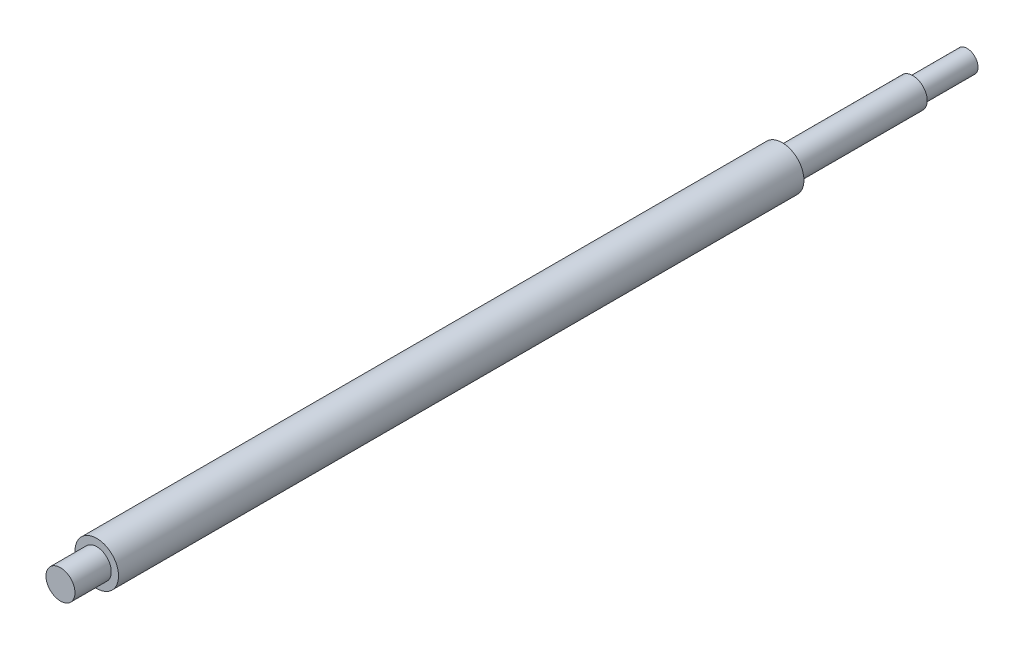
ISO-10303-21;
HEADER;
FILE_DESCRIPTION(('STEP AP214'),'2;1');
FILE_NAME('part.step','',(''),(''),'','','');
FILE_SCHEMA(('AUTOMOTIVE_DESIGN { 1 0 10303 214 1 1 1 1 }'));
ENDSEC;
DATA;
#1=APPLICATION_CONTEXT('core data for automotive mechanical design processes');
#2=APPLICATION_PROTOCOL_DEFINITION('international standard','automotive_design',2000,#1);
#3=PRODUCT_CONTEXT('',#1,'mechanical');
#4=PRODUCT('Part','Part','',(#3));
#5=PRODUCT_RELATED_PRODUCT_CATEGORY('part','',(#4));
#6=PRODUCT_DEFINITION_FORMATION('','',#4);
#7=PRODUCT_DEFINITION_CONTEXT('part definition',#1,'design');
#8=PRODUCT_DEFINITION('design','',#6,#7);
#9=PRODUCT_DEFINITION_SHAPE('','',#8);
#10=(LENGTH_UNIT() NAMED_UNIT(*) SI_UNIT(.MILLI.,.METRE.));
#11=(NAMED_UNIT(*) PLANE_ANGLE_UNIT() SI_UNIT($,.RADIAN.));
#12=(NAMED_UNIT(*) SI_UNIT($,.STERADIAN.) SOLID_ANGLE_UNIT());
#13=UNCERTAINTY_MEASURE_WITH_UNIT(LENGTH_MEASURE(1.E-05),#10,'distance_accuracy_value','');
#14=(GEOMETRIC_REPRESENTATION_CONTEXT(3) GLOBAL_UNCERTAINTY_ASSIGNED_CONTEXT((#13)) GLOBAL_UNIT_ASSIGNED_CONTEXT((#10,
#11,#12)) REPRESENTATION_CONTEXT('',''));
#15=CARTESIAN_POINT('',(0.,0.,0.));
#16=DIRECTION('',(0.,0.,1.));
#17=DIRECTION('',(1.,0.,0.));
#18=AXIS2_PLACEMENT_3D('',#15,#16,#17);
#19=CARTESIAN_POINT('',(0.,0.,250.));
#20=DIRECTION('',(0.,0.,-1.));
#21=DIRECTION('',(-1.,0.,0.));
#22=AXIS2_PLACEMENT_3D('',#19,#20,#21);
#23=CYLINDRICAL_SURFACE('',#22,6.);
#24=CARTESIAN_POINT('',(0.,0.,51.));
#25=DIRECTION('',(0.,0.,-1.));
#26=DIRECTION('',(-1.,0.,0.));
#27=AXIS2_PLACEMENT_3D('',#24,#25,#26);
#28=CIRCLE('',#27,6.);
#29=CARTESIAN_POINT('',(-6.,0.,51.));
#30=VERTEX_POINT('',#29);
#31=EDGE_CURVE('E47',#30,#30,#28,.T.);
#32=ORIENTED_EDGE('',*,*,#31,.F.);
#33=EDGE_LOOP('',(#32));
#34=FACE_BOUND('',#33,.T.);
#35=CARTESIAN_POINT('',(0.,0.,240.));
#36=DIRECTION('',(0.,0.,1.));
#37=DIRECTION('',(1.,0.,0.));
#38=AXIS2_PLACEMENT_3D('',#35,#36,#37);
#39=CIRCLE('',#38,6.);
#40=CARTESIAN_POINT('',(6.,0.,240.));
#41=VERTEX_POINT('',#40);
#42=EDGE_CURVE('E38',#41,#41,#39,.T.);
#43=ORIENTED_EDGE('',*,*,#42,.F.);
#44=EDGE_LOOP('',(#43));
#45=FACE_BOUND('',#44,.T.);
#46=ADVANCED_FACE('F35',(#34,#45),#23,.T.);
#47=CARTESIAN_POINT('',(0.,0.,15.));
#48=DIRECTION('',(0.,0.,-1.));
#49=DIRECTION('',(-1.,0.,0.));
#50=AXIS2_PLACEMENT_3D('',#47,#48,#49);
#51=PLANE('',#50);
#52=CARTESIAN_POINT('',(0.,0.,15.));
#53=DIRECTION('',(0.,0.,-1.));
#54=DIRECTION('',(-1.,0.,0.));
#55=AXIS2_PLACEMENT_3D('',#52,#53,#54);
#56=CIRCLE('',#55,3.);
#57=CARTESIAN_POINT('',(-3.,0.,15.));
#58=VERTEX_POINT('',#57);
#59=EDGE_CURVE('E11',#58,#58,#56,.T.);
#60=ORIENTED_EDGE('',*,*,#59,.F.);
#61=EDGE_LOOP('',(#60));
#62=FACE_BOUND('',#61,.T.);
#63=CARTESIAN_POINT('',(0.,0.,15.));
#64=DIRECTION('',(0.,0.,-1.));
#65=DIRECTION('',(-1.,0.,0.));
#66=AXIS2_PLACEMENT_3D('',#63,#64,#65);
#67=CIRCLE('',#66,4.);
#68=CARTESIAN_POINT('',(-4.,0.,15.));
#69=VERTEX_POINT('',#68);
#70=EDGE_CURVE('E53',#69,#69,#67,.T.);
#71=ORIENTED_EDGE('',*,*,#70,.T.);
#72=EDGE_LOOP('',(#71));
#73=FACE_BOUND('',#72,.T.);
#74=ADVANCED_FACE('F62',(#62,#73),#51,.T.);
#75=CARTESIAN_POINT('',(0.,0.,15.));
#76=DIRECTION('',(0.,0.,-1.));
#77=DIRECTION('',(-1.,0.,0.));
#78=AXIS2_PLACEMENT_3D('',#75,#76,#77);
#79=CYLINDRICAL_SURFACE('',#78,3.);
#80=ORIENTED_EDGE('',*,*,#59,.T.);
#81=EDGE_LOOP('',(#80));
#82=FACE_BOUND('',#81,.T.);
#83=CARTESIAN_POINT('',(0.,0.,0.));
#84=DIRECTION('',(0.,0.,-1.));
#85=DIRECTION('',(-1.,0.,0.));
#86=AXIS2_PLACEMENT_3D('',#83,#84,#85);
#87=CIRCLE('',#86,3.);
#88=CARTESIAN_POINT('',(-3.,0.,0.));
#89=VERTEX_POINT('',#88);
#90=EDGE_CURVE('E42',#89,#89,#87,.T.);
#91=ORIENTED_EDGE('',*,*,#90,.F.);
#92=EDGE_LOOP('',(#91));
#93=FACE_BOUND('',#92,.T.);
#94=ADVANCED_FACE('F98',(#82,#93),#79,.T.);
#95=CARTESIAN_POINT('',(0.,0.,0.));
#96=DIRECTION('',(0.,0.,1.));
#97=DIRECTION('',(1.,0.,0.));
#98=AXIS2_PLACEMENT_3D('',#95,#96,#97);
#99=PLANE('',#98);
#100=ORIENTED_EDGE('',*,*,#90,.T.);
#101=EDGE_LOOP('',(#100));
#102=FACE_BOUND('',#101,.T.);
#103=ADVANCED_FACE('F96',(#102),#99,.F.);
#104=CARTESIAN_POINT('',(0.,0.,51.));
#105=DIRECTION('',(0.,0.,-1.));
#106=DIRECTION('',(-1.,0.,0.));
#107=AXIS2_PLACEMENT_3D('',#104,#105,#106);
#108=PLANE('',#107);
#109=CARTESIAN_POINT('',(0.,0.,51.));
#110=DIRECTION('',(0.,0.,-1.));
#111=DIRECTION('',(-1.,0.,0.));
#112=AXIS2_PLACEMENT_3D('',#109,#110,#111);
#113=CIRCLE('',#112,4.);
#114=CARTESIAN_POINT('',(-4.,0.,51.));
#115=VERTEX_POINT('',#114);
#116=EDGE_CURVE('E50',#115,#115,#113,.T.);
#117=ORIENTED_EDGE('',*,*,#116,.F.);
#118=EDGE_LOOP('',(#117));
#119=FACE_BOUND('',#118,.T.);
#120=ORIENTED_EDGE('',*,*,#31,.T.);
#121=EDGE_LOOP('',(#120));
#122=FACE_BOUND('',#121,.T.);
#123=ADVANCED_FACE('F58',(#119,#122),#108,.T.);
#124=CARTESIAN_POINT('',(0.,0.,51.));
#125=DIRECTION('',(0.,0.,-1.));
#126=DIRECTION('',(-1.,0.,0.));
#127=AXIS2_PLACEMENT_3D('',#124,#125,#126);
#128=CYLINDRICAL_SURFACE('',#127,4.);
#129=ORIENTED_EDGE('',*,*,#70,.F.);
#130=EDGE_LOOP('',(#129));
#131=FACE_BOUND('',#130,.T.);
#132=ORIENTED_EDGE('',*,*,#116,.T.);
#133=EDGE_LOOP('',(#132));
#134=FACE_BOUND('',#133,.T.);
#135=ADVANCED_FACE('F87',(#131,#134),#128,.T.);
#136=CARTESIAN_POINT('',(0.,0.,240.));
#137=DIRECTION('',(0.,0.,1.));
#138=DIRECTION('',(1.,0.,0.));
#139=AXIS2_PLACEMENT_3D('',#136,#137,#138);
#140=PLANE('',#139);
#141=CARTESIAN_POINT('',(0.,0.,240.));
#142=DIRECTION('',(0.,0.,1.));
#143=DIRECTION('',(1.,0.,0.));
#144=AXIS2_PLACEMENT_3D('',#141,#142,#143);
#145=CIRCLE('',#144,4.);
#146=CARTESIAN_POINT('',(4.,0.,240.));
#147=VERTEX_POINT('',#146);
#148=EDGE_CURVE('E66',#147,#147,#145,.T.);
#149=ORIENTED_EDGE('',*,*,#148,.F.);
#150=EDGE_LOOP('',(#149));
#151=FACE_BOUND('',#150,.T.);
#152=ORIENTED_EDGE('',*,*,#42,.T.);
#153=EDGE_LOOP('',(#152));
#154=FACE_BOUND('',#153,.T.);
#155=ADVANCED_FACE('F80',(#151,#154),#140,.T.);
#156=CARTESIAN_POINT('',(0.,0.,240.));
#157=DIRECTION('',(0.,0.,1.));
#158=DIRECTION('',(1.,0.,0.));
#159=AXIS2_PLACEMENT_3D('',#156,#157,#158);
#160=CYLINDRICAL_SURFACE('',#159,4.);
#161=ORIENTED_EDGE('',*,*,#148,.T.);
#162=EDGE_LOOP('',(#161));
#163=FACE_BOUND('',#162,.T.);
#164=CARTESIAN_POINT('',(0.,0.,250.));
#165=DIRECTION('',(0.,0.,1.));
#166=DIRECTION('',(1.,0.,0.));
#167=AXIS2_PLACEMENT_3D('',#164,#165,#166);
#168=CIRCLE('',#167,4.);
#169=CARTESIAN_POINT('',(4.,0.,250.));
#170=VERTEX_POINT('',#169);
#171=EDGE_CURVE('E69',#170,#170,#168,.T.);
#172=ORIENTED_EDGE('',*,*,#171,.F.);
#173=EDGE_LOOP('',(#172));
#174=FACE_BOUND('',#173,.T.);
#175=ADVANCED_FACE('F78',(#163,#174),#160,.T.);
#176=CARTESIAN_POINT('',(0.,0.,250.));
#177=DIRECTION('',(0.,0.,1.));
#178=DIRECTION('',(1.,0.,0.));
#179=AXIS2_PLACEMENT_3D('',#176,#177,#178);
#180=PLANE('',#179);
#181=ORIENTED_EDGE('',*,*,#171,.T.);
#182=EDGE_LOOP('',(#181));
#183=FACE_BOUND('',#182,.T.);
#184=ADVANCED_FACE('F76',(#183),#180,.T.);
#185=CLOSED_SHELL('',(#46,#74,#94,#103,#123,#135,#155,#175,#184));
#186=MANIFOLD_SOLID_BREP('B2',#185);
#187=ADVANCED_BREP_SHAPE_REPRESENTATION('',(#18,#186),#14);
#188=SHAPE_DEFINITION_REPRESENTATION(#9,#187);
ENDSEC;
END-ISO-10303-21;
